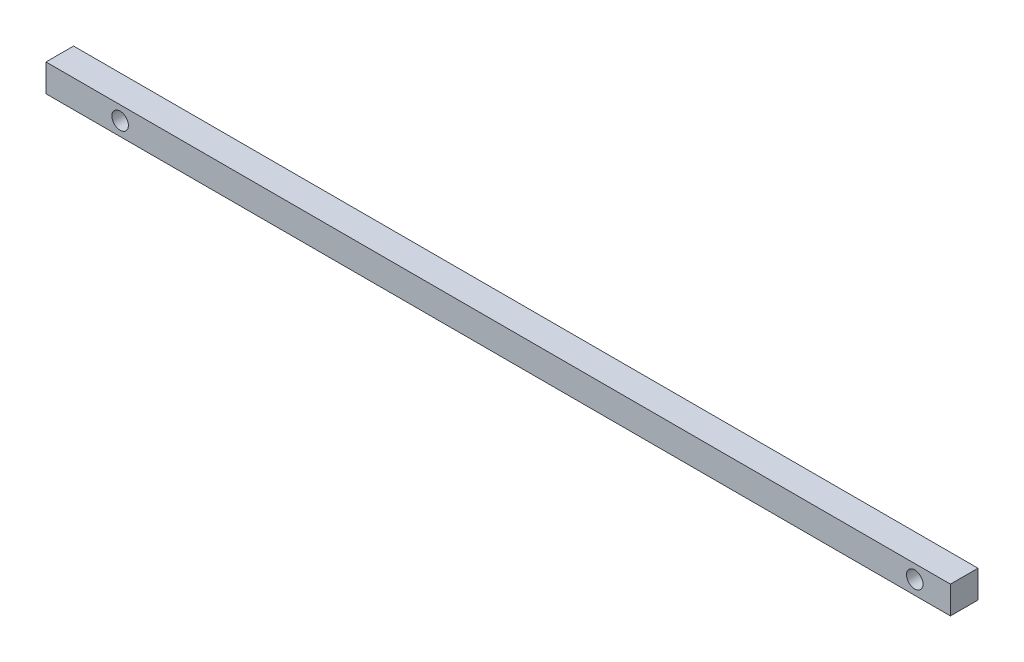
ISO-10303-21;
HEADER;
FILE_DESCRIPTION(('STEP AP214'),'2;1');
FILE_NAME('part.step','',(''),(''),'','','');
FILE_SCHEMA(('AUTOMOTIVE_DESIGN { 1 0 10303 214 1 1 1 1 }'));
ENDSEC;
DATA;
#1=APPLICATION_CONTEXT('core data for automotive mechanical design processes');
#2=APPLICATION_PROTOCOL_DEFINITION('international standard','automotive_design',2000,#1);
#3=PRODUCT_CONTEXT('',#1,'mechanical');
#4=PRODUCT('Part','Part','',(#3));
#5=PRODUCT_RELATED_PRODUCT_CATEGORY('part','',(#4));
#6=PRODUCT_DEFINITION_FORMATION('','',#4);
#7=PRODUCT_DEFINITION_CONTEXT('part definition',#1,'design');
#8=PRODUCT_DEFINITION('design','',#6,#7);
#9=PRODUCT_DEFINITION_SHAPE('','',#8);
#10=(LENGTH_UNIT() NAMED_UNIT(*) SI_UNIT(.MILLI.,.METRE.));
#11=(NAMED_UNIT(*) PLANE_ANGLE_UNIT() SI_UNIT($,.RADIAN.));
#12=(NAMED_UNIT(*) SI_UNIT($,.STERADIAN.) SOLID_ANGLE_UNIT());
#13=UNCERTAINTY_MEASURE_WITH_UNIT(LENGTH_MEASURE(1.E-05),#10,'distance_accuracy_value','');
#14=(GEOMETRIC_REPRESENTATION_CONTEXT(3) GLOBAL_UNCERTAINTY_ASSIGNED_CONTEXT((#13)) GLOBAL_UNIT_ASSIGNED_CONTEXT((#10,
#11,#12)) REPRESENTATION_CONTEXT('',''));
#15=CARTESIAN_POINT('',(0.,0.,0.));
#16=DIRECTION('',(0.,0.,1.));
#17=DIRECTION('',(1.,0.,0.));
#18=AXIS2_PLACEMENT_3D('',#15,#16,#17);
#19=CARTESIAN_POINT('',(0.,0.,25.));
#20=DIRECTION('',(0.,0.,1.));
#21=DIRECTION('',(1.,0.,0.));
#22=AXIS2_PLACEMENT_3D('',#19,#20,#21);
#23=PLANE('',#22);
#24=CARTESIAN_POINT('',(-342.787107350496,0.,25.));
#25=DIRECTION('',(0.,0.,1.));
#26=DIRECTION('',(1.,0.,0.));
#27=AXIS2_PLACEMENT_3D('',#24,#25,#26);
#28=CIRCLE('',#27,7.50000000000001);
#29=CARTESIAN_POINT('',(-335.287107350496,0.,25.));
#30=VERTEX_POINT('',#29);
#31=EDGE_CURVE('E114',#30,#30,#28,.T.);
#32=ORIENTED_EDGE('',*,*,#31,.F.);
#33=EDGE_LOOP('',(#32));
#34=FACE_BOUND('',#33,.T.);
#35=DIRECTION('',(0.,1.,0.));
#36=VECTOR('',#35,1.);
#37=CARTESIAN_POINT('',(410.,12.5,25.));
#38=LINE('',#37,#36);
#39=CARTESIAN_POINT('',(410.,-12.5,25.));
#40=VERTEX_POINT('',#39);
#41=CARTESIAN_POINT('',(410.,12.5,25.));
#42=VERTEX_POINT('',#41);
#43=EDGE_CURVE('E94',#40,#42,#38,.T.);
#44=ORIENTED_EDGE('',*,*,#43,.T.);
#45=DIRECTION('',(-1.,0.,0.));
#46=VECTOR('',#45,1.);
#47=CARTESIAN_POINT('',(-410.,12.5,25.));
#48=LINE('',#47,#46);
#49=CARTESIAN_POINT('',(-410.,12.5,25.));
#50=VERTEX_POINT('',#49);
#51=EDGE_CURVE('E89',#42,#50,#48,.T.);
#52=ORIENTED_EDGE('',*,*,#51,.T.);
#53=DIRECTION('',(0.,-1.,0.));
#54=VECTOR('',#53,1.);
#55=CARTESIAN_POINT('',(-410.,12.5,25.));
#56=LINE('',#55,#54);
#57=CARTESIAN_POINT('',(-410.,-12.5,25.));
#58=VERTEX_POINT('',#57);
#59=EDGE_CURVE('E92',#50,#58,#56,.T.);
#60=ORIENTED_EDGE('',*,*,#59,.T.);
#61=DIRECTION('',(1.,0.,0.));
#62=VECTOR('',#61,1.);
#63=CARTESIAN_POINT('',(-410.,-12.5,25.));
#64=LINE('',#63,#62);
#65=EDGE_CURVE('E59',#58,#40,#64,.T.);
#66=ORIENTED_EDGE('',*,*,#65,.T.);
#67=EDGE_LOOP('',(#44,#52,#60,#66));
#68=FACE_BOUND('',#67,.T.);
#69=CARTESIAN_POINT('',(377.642892649504,0.,25.));
#70=DIRECTION('',(0.,0.,1.));
#71=DIRECTION('',(1.,0.,0.));
#72=AXIS2_PLACEMENT_3D('',#69,#70,#71);
#73=CIRCLE('',#72,7.50000000000001);
#74=CARTESIAN_POINT('',(385.142892649504,0.,25.));
#75=VERTEX_POINT('',#74);
#76=EDGE_CURVE('E136',#75,#75,#73,.T.);
#77=ORIENTED_EDGE('',*,*,#76,.F.);
#78=EDGE_LOOP('',(#77));
#79=FACE_BOUND('',#78,.T.);
#80=ADVANCED_FACE('F41',(#34,#68,#79),#23,.T.);
#81=CARTESIAN_POINT('',(0.,0.,0.));
#82=DIRECTION('',(0.,0.,1.));
#83=DIRECTION('',(1.,0.,0.));
#84=AXIS2_PLACEMENT_3D('',#81,#82,#83);
#85=PLANE('',#84);
#86=DIRECTION('',(0.,1.,0.));
#87=VECTOR('',#86,1.);
#88=CARTESIAN_POINT('',(410.,12.5,0.));
#89=LINE('',#88,#87);
#90=CARTESIAN_POINT('',(410.,-12.5,0.));
#91=VERTEX_POINT('',#90);
#92=CARTESIAN_POINT('',(410.,12.5,0.));
#93=VERTEX_POINT('',#92);
#94=EDGE_CURVE('E110',#91,#93,#89,.T.);
#95=ORIENTED_EDGE('',*,*,#94,.F.);
#96=DIRECTION('',(1.,0.,0.));
#97=VECTOR('',#96,1.);
#98=CARTESIAN_POINT('',(-410.,-12.5,0.));
#99=LINE('',#98,#97);
#100=CARTESIAN_POINT('',(-410.,-12.5,0.));
#101=VERTEX_POINT('',#100);
#102=EDGE_CURVE('E82',#101,#91,#99,.T.);
#103=ORIENTED_EDGE('',*,*,#102,.F.);
#104=DIRECTION('',(0.,-1.,0.));
#105=VECTOR('',#104,1.);
#106=CARTESIAN_POINT('',(-410.,12.5,0.));
#107=LINE('',#106,#105);
#108=CARTESIAN_POINT('',(-410.,12.5,0.));
#109=VERTEX_POINT('',#108);
#110=EDGE_CURVE('E76',#109,#101,#107,.T.);
#111=ORIENTED_EDGE('',*,*,#110,.F.);
#112=DIRECTION('',(-1.,0.,0.));
#113=VECTOR('',#112,1.);
#114=CARTESIAN_POINT('',(-410.,12.5,0.));
#115=LINE('',#114,#113);
#116=EDGE_CURVE('E99',#93,#109,#115,.T.);
#117=ORIENTED_EDGE('',*,*,#116,.F.);
#118=EDGE_LOOP('',(#95,#103,#111,#117));
#119=FACE_BOUND('',#118,.T.);
#120=CARTESIAN_POINT('',(-342.787107350496,0.,0.));
#121=DIRECTION('',(0.,0.,1.));
#122=DIRECTION('',(1.,0.,0.));
#123=AXIS2_PLACEMENT_3D('',#120,#121,#122);
#124=CIRCLE('',#123,7.50000000000001);
#125=CARTESIAN_POINT('',(-335.287107350496,0.,0.));
#126=VERTEX_POINT('',#125);
#127=EDGE_CURVE('E132',#126,#126,#124,.T.);
#128=ORIENTED_EDGE('',*,*,#127,.T.);
#129=EDGE_LOOP('',(#128));
#130=FACE_BOUND('',#129,.T.);
#131=CARTESIAN_POINT('',(377.642892649504,0.,0.));
#132=DIRECTION('',(0.,0.,1.));
#133=DIRECTION('',(1.,0.,0.));
#134=AXIS2_PLACEMENT_3D('',#131,#132,#133);
#135=CIRCLE('',#134,7.50000000000001);
#136=CARTESIAN_POINT('',(385.142892649504,0.,0.));
#137=VERTEX_POINT('',#136);
#138=EDGE_CURVE('E140',#137,#137,#135,.T.);
#139=ORIENTED_EDGE('',*,*,#138,.T.);
#140=EDGE_LOOP('',(#139));
#141=FACE_BOUND('',#140,.T.);
#142=ADVANCED_FACE('F127',(#119,#130,#141),#85,.F.);
#143=CARTESIAN_POINT('',(410.,12.5,25.));
#144=DIRECTION('',(-1.,0.,0.));
#145=DIRECTION('',(0.,0.,1.));
#146=AXIS2_PLACEMENT_3D('',#143,#144,#145);
#147=PLANE('',#146);
#148=ORIENTED_EDGE('',*,*,#94,.T.);
#149=DIRECTION('',(0.,0.,-1.));
#150=VECTOR('',#149,1.);
#151=CARTESIAN_POINT('',(410.,12.5,25.));
#152=LINE('',#151,#150);
#153=EDGE_CURVE('E11',#42,#93,#152,.T.);
#154=ORIENTED_EDGE('',*,*,#153,.F.);
#155=ORIENTED_EDGE('',*,*,#43,.F.);
#156=DIRECTION('',(0.,0.,-1.));
#157=VECTOR('',#156,1.);
#158=CARTESIAN_POINT('',(410.,-12.5,25.));
#159=LINE('',#158,#157);
#160=EDGE_CURVE('E106',#40,#91,#159,.T.);
#161=ORIENTED_EDGE('',*,*,#160,.T.);
#162=EDGE_LOOP('',(#148,#154,#155,#161));
#163=FACE_BOUND('',#162,.T.);
#164=ADVANCED_FACE('F43',(#163),#147,.F.);
#165=CARTESIAN_POINT('',(-410.,12.5,25.));
#166=DIRECTION('',(0.,-1.,0.));
#167=DIRECTION('',(0.,0.,-1.));
#168=AXIS2_PLACEMENT_3D('',#165,#166,#167);
#169=PLANE('',#168);
#170=ORIENTED_EDGE('',*,*,#116,.T.);
#171=DIRECTION('',(0.,0.,-1.));
#172=VECTOR('',#171,1.);
#173=CARTESIAN_POINT('',(-410.,12.5,25.));
#174=LINE('',#173,#172);
#175=EDGE_CURVE('E51',#50,#109,#174,.T.);
#176=ORIENTED_EDGE('',*,*,#175,.F.);
#177=ORIENTED_EDGE('',*,*,#51,.F.);
#178=ORIENTED_EDGE('',*,*,#153,.T.);
#179=EDGE_LOOP('',(#170,#176,#177,#178));
#180=FACE_BOUND('',#179,.T.);
#181=ADVANCED_FACE('F98',(#180),#169,.F.);
#182=CARTESIAN_POINT('',(-410.,12.5,25.));
#183=DIRECTION('',(1.,0.,0.));
#184=DIRECTION('',(0.,0.,-1.));
#185=AXIS2_PLACEMENT_3D('',#182,#183,#184);
#186=PLANE('',#185);
#187=ORIENTED_EDGE('',*,*,#110,.T.);
#188=DIRECTION('',(0.,0.,-1.));
#189=VECTOR('',#188,1.);
#190=CARTESIAN_POINT('',(-410.,-12.5,25.));
#191=LINE('',#190,#189);
#192=EDGE_CURVE('E101',#58,#101,#191,.T.);
#193=ORIENTED_EDGE('',*,*,#192,.F.);
#194=ORIENTED_EDGE('',*,*,#59,.F.);
#195=ORIENTED_EDGE('',*,*,#175,.T.);
#196=EDGE_LOOP('',(#187,#193,#194,#195));
#197=FACE_BOUND('',#196,.T.);
#198=ADVANCED_FACE('F102',(#197),#186,.F.);
#199=CARTESIAN_POINT('',(-410.,-12.5,25.));
#200=DIRECTION('',(0.,1.,0.));
#201=DIRECTION('',(0.,0.,1.));
#202=AXIS2_PLACEMENT_3D('',#199,#200,#201);
#203=PLANE('',#202);
#204=ORIENTED_EDGE('',*,*,#102,.T.);
#205=ORIENTED_EDGE('',*,*,#160,.F.);
#206=ORIENTED_EDGE('',*,*,#65,.F.);
#207=ORIENTED_EDGE('',*,*,#192,.T.);
#208=EDGE_LOOP('',(#204,#205,#206,#207));
#209=FACE_BOUND('',#208,.T.);
#210=ADVANCED_FACE('F124',(#209),#203,.F.);
#211=CARTESIAN_POINT('',(-342.787107350496,0.,25.));
#212=DIRECTION('',(0.,0.,-1.));
#213=DIRECTION('',(-1.,0.,0.));
#214=AXIS2_PLACEMENT_3D('',#211,#212,#213);
#215=CYLINDRICAL_SURFACE('',#214,7.50000000000001);
#216=ORIENTED_EDGE('',*,*,#31,.T.);
#217=EDGE_LOOP('',(#216));
#218=FACE_BOUND('',#217,.T.);
#219=ORIENTED_EDGE('',*,*,#127,.F.);
#220=EDGE_LOOP('',(#219));
#221=FACE_BOUND('',#220,.T.);
#222=ADVANCED_FACE('F159',(#218,#221),#215,.F.);
#223=CARTESIAN_POINT('',(377.642892649504,0.,25.));
#224=DIRECTION('',(0.,0.,-1.));
#225=DIRECTION('',(-1.,0.,0.));
#226=AXIS2_PLACEMENT_3D('',#223,#224,#225);
#227=CYLINDRICAL_SURFACE('',#226,7.50000000000001);
#228=ORIENTED_EDGE('',*,*,#76,.T.);
#229=EDGE_LOOP('',(#228));
#230=FACE_BOUND('',#229,.T.);
#231=ORIENTED_EDGE('',*,*,#138,.F.);
#232=EDGE_LOOP('',(#231));
#233=FACE_BOUND('',#232,.T.);
#234=ADVANCED_FACE('F148',(#230,#233),#227,.F.);
#235=CLOSED_SHELL('',(#80,#142,#164,#181,#198,#210,#222,#234));
#236=MANIFOLD_SOLID_BREP('B2',#235);
#237=ADVANCED_BREP_SHAPE_REPRESENTATION('',(#18,#236),#14);
#238=SHAPE_DEFINITION_REPRESENTATION(#9,#237);
ENDSEC;
END-ISO-10303-21;
